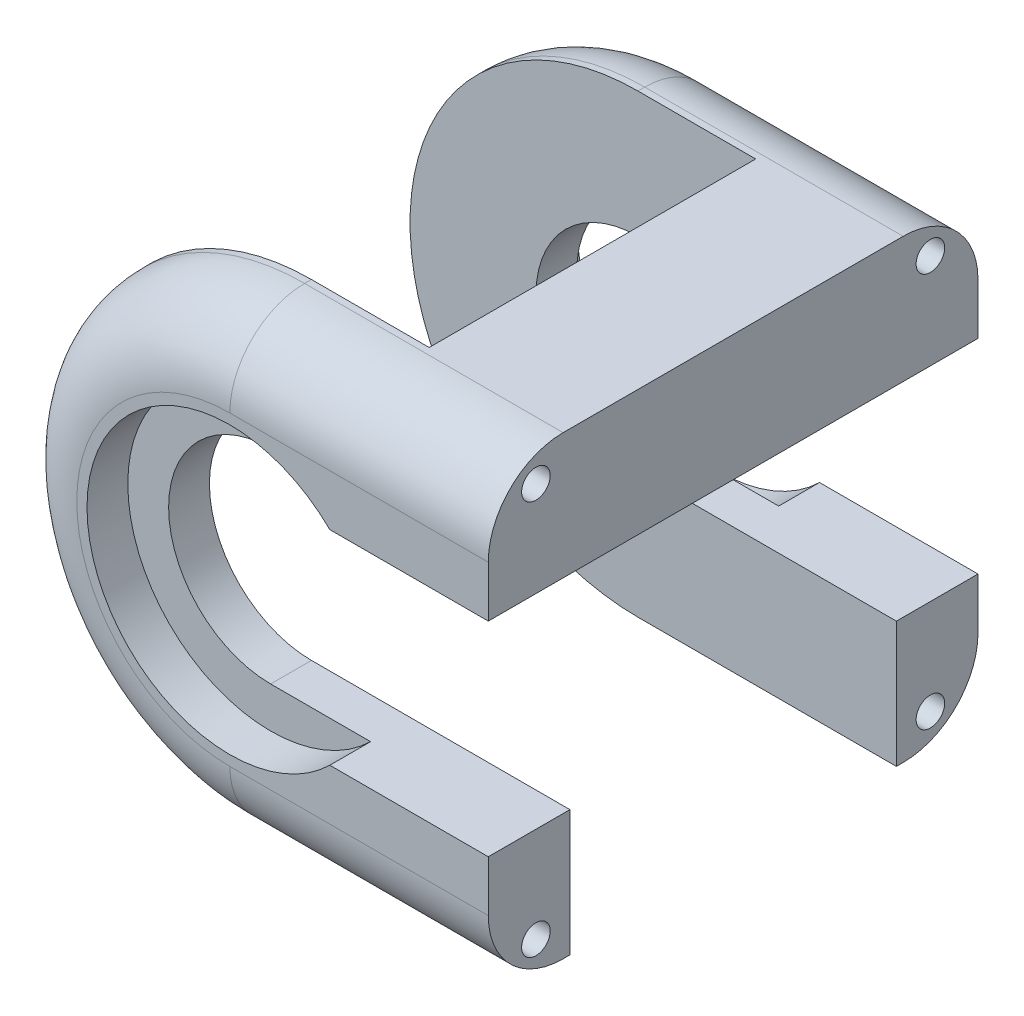
ISO-10303-21;
HEADER;
FILE_DESCRIPTION(('STEP AP214'),'2;1');
FILE_NAME('part.step','',(''),(''),'','','');
FILE_SCHEMA(('AUTOMOTIVE_DESIGN { 1 0 10303 214 1 1 1 1 }'));
ENDSEC;
DATA;
#1=APPLICATION_CONTEXT('core data for automotive mechanical design processes');
#2=APPLICATION_PROTOCOL_DEFINITION('international standard','automotive_design',2000,#1);
#3=PRODUCT_CONTEXT('',#1,'mechanical');
#4=PRODUCT('Part','Part','',(#3));
#5=PRODUCT_RELATED_PRODUCT_CATEGORY('part','',(#4));
#6=PRODUCT_DEFINITION_FORMATION('','',#4);
#7=PRODUCT_DEFINITION_CONTEXT('part definition',#1,'design');
#8=PRODUCT_DEFINITION('design','',#6,#7);
#9=PRODUCT_DEFINITION_SHAPE('','',#8);
#10=(LENGTH_UNIT() NAMED_UNIT(*) SI_UNIT(.MILLI.,.METRE.));
#11=(NAMED_UNIT(*) PLANE_ANGLE_UNIT() SI_UNIT($,.RADIAN.));
#12=(NAMED_UNIT(*) SI_UNIT($,.STERADIAN.) SOLID_ANGLE_UNIT());
#13=UNCERTAINTY_MEASURE_WITH_UNIT(LENGTH_MEASURE(1.E-05),#10,'distance_accuracy_value','');
#14=(GEOMETRIC_REPRESENTATION_CONTEXT(3) GLOBAL_UNCERTAINTY_ASSIGNED_CONTEXT((#13)) GLOBAL_UNIT_ASSIGNED_CONTEXT((#10,
#11,#12)) REPRESENTATION_CONTEXT('',''));
#15=CARTESIAN_POINT('',(0.,0.,0.));
#16=DIRECTION('',(0.,0.,1.));
#17=DIRECTION('',(1.,0.,0.));
#18=AXIS2_PLACEMENT_3D('',#15,#16,#17);
#19=CARTESIAN_POINT('',(0.,0.,72.));
#20=DIRECTION('',(1.,0.,0.));
#21=DIRECTION('',(0.,1.,0.));
#22=AXIS2_PLACEMENT_3D('',#19,#20,#21);
#23=PLANE('',#22);
#24=DIRECTION('',(0.,-1.,0.));
#25=VECTOR('',#24,1.);
#26=CARTESIAN_POINT('',(0.,18.5,12.));
#27=LINE('',#26,#25);
#28=CARTESIAN_POINT('',(0.,18.5,12.));
#29=VERTEX_POINT('',#28);
#30=CARTESIAN_POINT('',(0.,0.,12.));
#31=VERTEX_POINT('',#30);
#32=EDGE_CURVE('E246',#29,#31,#27,.T.);
#33=ORIENTED_EDGE('',*,*,#32,.T.);
#34=DIRECTION('',(0.,0.,-1.));
#35=VECTOR('',#34,1.);
#36=CARTESIAN_POINT('',(0.,0.,72.));
#37=LINE('',#36,#35);
#38=CARTESIAN_POINT('',(0.,0.,11.));
#39=VERTEX_POINT('',#38);
#40=EDGE_CURVE('E254',#31,#39,#37,.T.);
#41=ORIENTED_EDGE('',*,*,#40,.T.);
#42=CARTESIAN_POINT('',(0.,11.,11.));
#43=DIRECTION('',(1.,0.,0.));
#44=DIRECTION('',(0.,1.,0.));
#45=AXIS2_PLACEMENT_3D('',#42,#43,#44);
#46=CIRCLE('',#45,11.);
#47=CARTESIAN_POINT('',(0.,11.,0.));
#48=VERTEX_POINT('',#47);
#49=EDGE_CURVE('E307',#39,#48,#46,.T.);
#50=ORIENTED_EDGE('',*,*,#49,.T.);
#51=DIRECTION('',(0.,-1.,0.));
#52=VECTOR('',#51,1.);
#53=CARTESIAN_POINT('',(0.,0.,0.));
#54=LINE('',#53,#52);
#55=CARTESIAN_POINT('',(0.,18.5,0.));
#56=VERTEX_POINT('',#55);
#57=EDGE_CURVE('E405',#56,#48,#54,.T.);
#58=ORIENTED_EDGE('',*,*,#57,.F.);
#59=DIRECTION('',(0.,0.,1.));
#60=VECTOR('',#59,1.);
#61=CARTESIAN_POINT('',(0.,18.5,-0.001000000000001));
#62=LINE('',#61,#60);
#63=EDGE_CURVE('E481',#56,#29,#62,.T.);
#64=ORIENTED_EDGE('',*,*,#63,.T.);
#65=EDGE_LOOP('',(#33,#41,#50,#58,#64));
#66=FACE_BOUND('',#65,.T.);
#67=CARTESIAN_POINT('',(0.,4.50000000000001,6.99999999999999));
#68=DIRECTION('',(1.,0.,0.));
#69=DIRECTION('',(0.,0.,-1.));
#70=AXIS2_PLACEMENT_3D('',#67,#68,#69);
#71=CIRCLE('',#70,2.09999999999999);
#72=CARTESIAN_POINT('',(0.,4.50000000000001,4.9));
#73=VERTEX_POINT('',#72);
#74=EDGE_CURVE('E720',#73,#73,#71,.T.);
#75=ORIENTED_EDGE('',*,*,#74,.F.);
#76=EDGE_LOOP('',(#75));
#77=FACE_BOUND('',#76,.T.);
#78=ADVANCED_FACE('F46',(#66,#77),#23,.T.);
#79=DIRECTION('',(0.,1.,0.));
#80=VECTOR('',#79,1.);
#81=CARTESIAN_POINT('',(0.,18.5,60.));
#82=LINE('',#81,#80);
#83=CARTESIAN_POINT('',(0.,0.,60.));
#84=VERTEX_POINT('',#83);
#85=CARTESIAN_POINT('',(0.,18.5,60.));
#86=VERTEX_POINT('',#85);
#87=EDGE_CURVE('E238',#84,#86,#82,.T.);
#88=ORIENTED_EDGE('',*,*,#87,.T.);
#89=CARTESIAN_POINT('',(0.,18.5,72.));
#90=VERTEX_POINT('',#89);
#91=EDGE_CURVE('E488',#86,#90,#62,.T.);
#92=ORIENTED_EDGE('',*,*,#91,.T.);
#93=DIRECTION('',(0.,-1.,0.));
#94=VECTOR('',#93,1.);
#95=CARTESIAN_POINT('',(0.,0.,72.));
#96=LINE('',#95,#94);
#97=CARTESIAN_POINT('',(0.,11.,72.));
#98=VERTEX_POINT('',#97);
#99=EDGE_CURVE('E410',#90,#98,#96,.T.);
#100=ORIENTED_EDGE('',*,*,#99,.T.);
#101=CARTESIAN_POINT('',(0.,11.,61.));
#102=DIRECTION('',(1.,0.,0.));
#103=DIRECTION('',(0.,1.,0.));
#104=AXIS2_PLACEMENT_3D('',#101,#102,#103);
#105=CIRCLE('',#104,11.);
#106=CARTESIAN_POINT('',(0.,0.,61.));
#107=VERTEX_POINT('',#106);
#108=EDGE_CURVE('E251',#98,#107,#105,.T.);
#109=ORIENTED_EDGE('',*,*,#108,.T.);
#110=EDGE_CURVE('E226',#107,#84,#37,.T.);
#111=ORIENTED_EDGE('',*,*,#110,.T.);
#112=EDGE_LOOP('',(#88,#92,#100,#109,#111));
#113=FACE_BOUND('',#112,.T.);
#114=CARTESIAN_POINT('',(0.,4.5,65.));
#115=DIRECTION('',(1.,0.,0.));
#116=DIRECTION('',(0.,0.,-1.));
#117=AXIS2_PLACEMENT_3D('',#114,#115,#116);
#118=CIRCLE('',#117,2.09999999999999);
#119=CARTESIAN_POINT('',(0.,4.5,62.9));
#120=VERTEX_POINT('',#119);
#121=EDGE_CURVE('E728',#120,#120,#118,.T.);
#122=ORIENTED_EDGE('',*,*,#121,.F.);
#123=EDGE_LOOP('',(#122));
#124=FACE_BOUND('',#123,.T.);
#125=ADVANCED_FACE('F248',(#113,#124),#23,.T.);
#126=CARTESIAN_POINT('',(-38.,33.5,200.));
#127=DIRECTION('',(0.,0.,-1.));
#128=DIRECTION('',(-1.,0.,0.));
#129=AXIS2_PLACEMENT_3D('',#126,#127,#128);
#130=CYLINDRICAL_SURFACE('',#129,15.);
#131=DIRECTION('',(0.,0.,-1.));
#132=VECTOR('',#131,1.);
#133=CARTESIAN_POINT('',(-38.,18.5,200.));
#134=LINE('',#133,#132);
#135=CARTESIAN_POINT('',(-38.,18.5,6.00000000000001));
#136=VERTEX_POINT('',#135);
#137=CARTESIAN_POINT('',(-38.,18.5,12.));
#138=VERTEX_POINT('',#137);
#139=EDGE_CURVE('E535',#136,#138,#134,.F.);
#140=ORIENTED_EDGE('',*,*,#139,.F.);
#141=CARTESIAN_POINT('',(-38.,33.5,6.00000000000001));
#142=DIRECTION('',(0.,0.,-1.));
#143=DIRECTION('',(-1.,0.,0.));
#144=AXIS2_PLACEMENT_3D('',#141,#142,#143);
#145=CIRCLE('',#144,15.);
#146=CARTESIAN_POINT('',(-38.,48.5,6.00000000000001));
#147=VERTEX_POINT('',#146);
#148=EDGE_CURVE('E235',#136,#147,#145,.T.);
#149=ORIENTED_EDGE('',*,*,#148,.T.);
#150=DIRECTION('',(0.,0.,1.));
#151=VECTOR('',#150,1.);
#152=CARTESIAN_POINT('',(-38.,48.5,-0.001000000000001));
#153=LINE('',#152,#151);
#154=CARTESIAN_POINT('',(-38.,48.5,12.));
#155=VERTEX_POINT('',#154);
#156=EDGE_CURVE('E486',#147,#155,#153,.T.);
#157=ORIENTED_EDGE('',*,*,#156,.T.);
#158=CARTESIAN_POINT('',(-38.,33.5,12.));
#159=DIRECTION('',(0.,0.,-1.));
#160=DIRECTION('',(-1.,0.,0.));
#161=AXIS2_PLACEMENT_3D('',#158,#159,#160);
#162=CIRCLE('',#161,15.);
#163=EDGE_CURVE('E279',#138,#155,#162,.T.);
#164=ORIENTED_EDGE('',*,*,#163,.F.);
#165=EDGE_LOOP('',(#140,#149,#157,#164));
#166=FACE_BOUND('',#165,.T.);
#167=ADVANCED_FACE('F455',(#166),#130,.F.);
#168=DIRECTION('',(0.,0.,-1.));
#169=VECTOR('',#168,1.);
#170=CARTESIAN_POINT('',(-38.,18.5,200.));
#171=LINE('',#170,#169);
#172=CARTESIAN_POINT('',(-38.,18.5,60.));
#173=VERTEX_POINT('',#172);
#174=CARTESIAN_POINT('',(-38.,18.5,66.));
#175=VERTEX_POINT('',#174);
#176=EDGE_CURVE('E532',#173,#175,#171,.F.);
#177=ORIENTED_EDGE('',*,*,#176,.F.);
#178=CARTESIAN_POINT('',(-38.,33.5,60.));
#179=DIRECTION('',(0.,0.,1.));
#180=DIRECTION('',(1.,0.,0.));
#181=AXIS2_PLACEMENT_3D('',#178,#179,#180);
#182=CIRCLE('',#181,15.);
#183=CARTESIAN_POINT('',(-38.,48.5,60.));
#184=VERTEX_POINT('',#183);
#185=EDGE_CURVE('E283',#184,#173,#182,.T.);
#186=ORIENTED_EDGE('',*,*,#185,.F.);
#187=CARTESIAN_POINT('',(-38.,48.5,66.));
#188=VERTEX_POINT('',#187);
#189=EDGE_CURVE('E480',#184,#188,#153,.T.);
#190=ORIENTED_EDGE('',*,*,#189,.T.);
#191=CARTESIAN_POINT('',(-38.,33.5,66.));
#192=DIRECTION('',(0.,0.,1.));
#193=DIRECTION('',(1.,0.,0.));
#194=AXIS2_PLACEMENT_3D('',#191,#192,#193);
#195=CIRCLE('',#194,15.);
#196=EDGE_CURVE('E360',#188,#175,#195,.T.);
#197=ORIENTED_EDGE('',*,*,#196,.T.);
#198=EDGE_LOOP('',(#177,#186,#190,#197));
#199=FACE_BOUND('',#198,.T.);
#200=ADVANCED_FACE('F563',(#199),#130,.F.);
#201=CARTESIAN_POINT('',(0.,0.,72.));
#202=DIRECTION('',(0.,-1.,0.));
#203=DIRECTION('',(1.,0.,0.));
#204=AXIS2_PLACEMENT_3D('',#201,#202,#203);
#205=PLANE('',#204);
#206=DIRECTION('',(-1.,0.,0.));
#207=VECTOR('',#206,1.);
#208=CARTESIAN_POINT('',(-71.5,0.,60.));
#209=LINE('',#208,#207);
#210=CARTESIAN_POINT('',(-38.,0.,60.));
#211=VERTEX_POINT('',#210);
#212=EDGE_CURVE('E221',#84,#211,#209,.T.);
#213=ORIENTED_EDGE('',*,*,#212,.F.);
#214=ORIENTED_EDGE('',*,*,#110,.F.);
#215=DIRECTION('',(-1.,0.,0.));
#216=VECTOR('',#215,1.);
#217=CARTESIAN_POINT('',(0.,0.,61.));
#218=LINE('',#217,#216);
#219=CARTESIAN_POINT('',(-38.,0.,61.));
#220=VERTEX_POINT('',#219);
#221=EDGE_CURVE('E288',#107,#220,#218,.T.);
#222=ORIENTED_EDGE('',*,*,#221,.T.);
#223=DIRECTION('',(0.,0.,-1.));
#224=VECTOR('',#223,1.);
#225=CARTESIAN_POINT('',(-38.,0.,72.));
#226=LINE('',#225,#224);
#227=EDGE_CURVE('E229',#220,#211,#226,.T.);
#228=ORIENTED_EDGE('',*,*,#227,.T.);
#229=EDGE_LOOP('',(#213,#214,#222,#228));
#230=FACE_BOUND('',#229,.T.);
#231=ADVANCED_FACE('F223',(#230),#205,.T.);
#232=CARTESIAN_POINT('',(-38.,33.5,72.));
#233=DIRECTION('',(0.,0.,-1.));
#234=DIRECTION('',(-1.,0.,0.));
#235=AXIS2_PLACEMENT_3D('',#232,#233,#234);
#236=CYLINDRICAL_SURFACE('',#235,33.5);
#237=ORIENTED_EDGE('',*,*,#227,.F.);
#238=CARTESIAN_POINT('',(-38.,33.5,61.));
#239=DIRECTION('',(0.,0.,1.));
#240=DIRECTION('',(1.,0.,0.));
#241=AXIS2_PLACEMENT_3D('',#238,#239,#240);
#242=CIRCLE('',#241,33.5);
#243=CARTESIAN_POINT('',(-38.,67.,61.));
#244=VERTEX_POINT('',#243);
#245=EDGE_CURVE('E313',#220,#244,#242,.F.);
#246=ORIENTED_EDGE('',*,*,#245,.T.);
#247=DIRECTION('',(0.,0.,-1.));
#248=VECTOR('',#247,1.);
#249=CARTESIAN_POINT('',(-38.,67.,72.));
#250=LINE('',#249,#248);
#251=CARTESIAN_POINT('',(-38.,67.,60.));
#252=VERTEX_POINT('',#251);
#253=EDGE_CURVE('E268',#244,#252,#250,.T.);
#254=ORIENTED_EDGE('',*,*,#253,.T.);
#255=CARTESIAN_POINT('',(-38.,33.5,60.));
#256=DIRECTION('',(0.,0.,1.));
#257=DIRECTION('',(1.,0.,0.));
#258=AXIS2_PLACEMENT_3D('',#255,#256,#257);
#259=CIRCLE('',#258,33.5);
#260=EDGE_CURVE('E389',#252,#211,#259,.T.);
#261=ORIENTED_EDGE('',*,*,#260,.T.);
#262=EDGE_LOOP('',(#237,#246,#254,#261));
#263=FACE_BOUND('',#262,.T.);
#264=ADVANCED_FACE('F460',(#263),#236,.T.);
#265=CARTESIAN_POINT('',(0.,62.5,65.));
#266=DIRECTION('',(1.,0.,0.));
#267=DIRECTION('',(0.,0.,-1.));
#268=AXIS2_PLACEMENT_3D('',#265,#266,#267);
#269=CIRCLE('',#268,2.09999999999999);
#270=CARTESIAN_POINT('',(0.,62.5,62.9));
#271=VERTEX_POINT('',#270);
#272=EDGE_CURVE('E245',#271,#271,#269,.T.);
#273=ORIENTED_EDGE('',*,*,#272,.F.);
#274=EDGE_LOOP('',(#273));
#275=FACE_BOUND('',#274,.T.);
#276=CARTESIAN_POINT('',(0.,62.5,6.99999999999999));
#277=DIRECTION('',(1.,0.,0.));
#278=DIRECTION('',(0.,0.,-1.));
#279=AXIS2_PLACEMENT_3D('',#276,#277,#278);
#280=CIRCLE('',#279,2.09999999999999);
#281=CARTESIAN_POINT('',(0.,62.5,4.9));
#282=VERTEX_POINT('',#281);
#283=EDGE_CURVE('E475',#282,#282,#280,.T.);
#284=ORIENTED_EDGE('',*,*,#283,.F.);
#285=EDGE_LOOP('',(#284));
#286=FACE_BOUND('',#285,.T.);
#287=DIRECTION('',(0.,0.,1.));
#288=VECTOR('',#287,1.);
#289=CARTESIAN_POINT('',(0.,48.5,-0.001000000000001));
#290=LINE('',#289,#288);
#291=CARTESIAN_POINT('',(0.,48.5,0.));
#292=VERTEX_POINT('',#291);
#293=CARTESIAN_POINT('',(0.,48.5,72.));
#294=VERTEX_POINT('',#293);
#295=EDGE_CURVE('E476',#292,#294,#290,.T.);
#296=ORIENTED_EDGE('',*,*,#295,.F.);
#297=CARTESIAN_POINT('',(0.,56.,0.));
#298=VERTEX_POINT('',#297);
#299=EDGE_CURVE('E263',#298,#292,#54,.T.);
#300=ORIENTED_EDGE('',*,*,#299,.F.);
#301=CARTESIAN_POINT('',(0.,56.,11.));
#302=DIRECTION('',(1.,0.,0.));
#303=DIRECTION('',(0.,1.,0.));
#304=AXIS2_PLACEMENT_3D('',#301,#302,#303);
#305=CIRCLE('',#304,11.);
#306=CARTESIAN_POINT('',(0.,67.,11.));
#307=VERTEX_POINT('',#306);
#308=EDGE_CURVE('E301',#298,#307,#305,.T.);
#309=ORIENTED_EDGE('',*,*,#308,.T.);
#310=DIRECTION('',(0.,0.,-1.));
#311=VECTOR('',#310,1.);
#312=CARTESIAN_POINT('',(0.,67.,72.));
#313=LINE('',#312,#311);
#314=CARTESIAN_POINT('',(0.,67.,61.));
#315=VERTEX_POINT('',#314);
#316=EDGE_CURVE('E271',#315,#307,#313,.T.);
#317=ORIENTED_EDGE('',*,*,#316,.F.);
#318=CARTESIAN_POINT('',(0.,56.,61.));
#319=DIRECTION('',(1.,0.,0.));
#320=DIRECTION('',(0.,1.,0.));
#321=AXIS2_PLACEMENT_3D('',#318,#319,#320);
#322=CIRCLE('',#321,11.);
#323=CARTESIAN_POINT('',(0.,56.,72.));
#324=VERTEX_POINT('',#323);
#325=EDGE_CURVE('E304',#315,#324,#322,.T.);
#326=ORIENTED_EDGE('',*,*,#325,.T.);
#327=EDGE_CURVE('E261',#324,#294,#96,.T.);
#328=ORIENTED_EDGE('',*,*,#327,.T.);
#329=EDGE_LOOP('',(#296,#300,#309,#317,#326,#328));
#330=FACE_BOUND('',#329,.T.);
#331=ADVANCED_FACE('F451',(#275,#286,#330),#23,.T.);
#332=CARTESIAN_POINT('',(0.,67.,72.));
#333=DIRECTION('',(0.,1.,0.));
#334=DIRECTION('',(0.,0.,1.));
#335=AXIS2_PLACEMENT_3D('',#332,#333,#334);
#336=PLANE('',#335);
#337=ORIENTED_EDGE('',*,*,#253,.F.);
#338=DIRECTION('',(1.,0.,0.));
#339=VECTOR('',#338,1.);
#340=CARTESIAN_POINT('',(0.,67.,61.));
#341=LINE('',#340,#339);
#342=EDGE_CURVE('E11',#244,#315,#341,.T.);
#343=ORIENTED_EDGE('',*,*,#342,.T.);
#344=ORIENTED_EDGE('',*,*,#316,.T.);
#345=DIRECTION('',(1.,0.,0.));
#346=VECTOR('',#345,1.);
#347=CARTESIAN_POINT('',(-38.,67.,11.));
#348=LINE('',#347,#346);
#349=CARTESIAN_POINT('',(-38.,67.,11.));
#350=VERTEX_POINT('',#349);
#351=EDGE_CURVE('E56',#307,#350,#348,.F.);
#352=ORIENTED_EDGE('',*,*,#351,.T.);
#353=CARTESIAN_POINT('',(-38.,67.,12.));
#354=VERTEX_POINT('',#353);
#355=EDGE_CURVE('E267',#354,#350,#250,.T.);
#356=ORIENTED_EDGE('',*,*,#355,.F.);
#357=DIRECTION('',(1.,0.,0.));
#358=VECTOR('',#357,1.);
#359=CARTESIAN_POINT('',(-71.5,67.,12.));
#360=LINE('',#359,#358);
#361=CARTESIAN_POINT('',(-20.6887285151124,67.,12.));
#362=VERTEX_POINT('',#361);
#363=EDGE_CURVE('E234',#354,#362,#360,.T.);
#364=ORIENTED_EDGE('',*,*,#363,.T.);
#365=DIRECTION('',(0.,0.,1.));
#366=VECTOR('',#365,1.);
#367=CARTESIAN_POINT('',(-20.6887285151124,67.,60.));
#368=LINE('',#367,#366);
#369=CARTESIAN_POINT('',(-20.6887285151124,67.,60.));
#370=VERTEX_POINT('',#369);
#371=EDGE_CURVE('E370',#362,#370,#368,.T.);
#372=ORIENTED_EDGE('',*,*,#371,.T.);
#373=DIRECTION('',(-1.,0.,0.));
#374=VECTOR('',#373,1.);
#375=CARTESIAN_POINT('',(-71.5,67.,60.));
#376=LINE('',#375,#374);
#377=EDGE_CURVE('E374',#370,#252,#376,.T.);
#378=ORIENTED_EDGE('',*,*,#377,.T.);
#379=EDGE_LOOP('',(#337,#343,#344,#352,#356,#364,#372,#378));
#380=FACE_BOUND('',#379,.T.);
#381=ADVANCED_FACE('F459',(#380),#336,.T.);
#382=ORIENTED_EDGE('',*,*,#355,.T.);
#383=CARTESIAN_POINT('',(-38.,33.5,11.));
#384=DIRECTION('',(0.,0.,1.));
#385=DIRECTION('',(1.,0.,0.));
#386=AXIS2_PLACEMENT_3D('',#383,#384,#385);
#387=CIRCLE('',#386,33.5);
#388=CARTESIAN_POINT('',(-38.,0.,11.));
#389=VERTEX_POINT('',#388);
#390=EDGE_CURVE('E326',#350,#389,#387,.T.);
#391=ORIENTED_EDGE('',*,*,#390,.T.);
#392=CARTESIAN_POINT('',(-38.,0.,12.));
#393=VERTEX_POINT('',#392);
#394=EDGE_CURVE('E253',#393,#389,#226,.T.);
#395=ORIENTED_EDGE('',*,*,#394,.F.);
#396=CARTESIAN_POINT('',(-38.,33.5,12.));
#397=DIRECTION('',(0.,0.,-1.));
#398=DIRECTION('',(-1.,0.,0.));
#399=AXIS2_PLACEMENT_3D('',#396,#397,#398);
#400=CIRCLE('',#399,33.5);
#401=EDGE_CURVE('E383',#393,#354,#400,.T.);
#402=ORIENTED_EDGE('',*,*,#401,.T.);
#403=EDGE_LOOP('',(#382,#391,#395,#402));
#404=FACE_BOUND('',#403,.T.);
#405=ADVANCED_FACE('F466',(#404),#236,.T.);
#406=ORIENTED_EDGE('',*,*,#40,.F.);
#407=DIRECTION('',(1.,0.,0.));
#408=VECTOR('',#407,1.);
#409=CARTESIAN_POINT('',(0.,0.,12.));
#410=LINE('',#409,#408);
#411=EDGE_CURVE('E275',#393,#31,#410,.T.);
#412=ORIENTED_EDGE('',*,*,#411,.F.);
#413=ORIENTED_EDGE('',*,*,#394,.T.);
#414=DIRECTION('',(-1.,0.,0.));
#415=VECTOR('',#414,1.);
#416=CARTESIAN_POINT('',(0.,0.,11.));
#417=LINE('',#416,#415);
#418=EDGE_CURVE('E278',#389,#39,#417,.F.);
#419=ORIENTED_EDGE('',*,*,#418,.T.);
#420=EDGE_LOOP('',(#406,#412,#413,#419));
#421=FACE_BOUND('',#420,.T.);
#422=ADVANCED_FACE('F596',(#421),#205,.T.);
#423=CARTESIAN_POINT('',(0.,0.,72.));
#424=DIRECTION('',(0.,0.,1.));
#425=DIRECTION('',(1.,0.,0.));
#426=AXIS2_PLACEMENT_3D('',#423,#424,#425);
#427=PLANE('',#426);
#428=DIRECTION('',(1.,0.,0.));
#429=VECTOR('',#428,1.);
#430=CARTESIAN_POINT('',(0.,18.5,72.));
#431=LINE('',#430,#429);
#432=CARTESIAN_POINT('',(-23.3030615433009,18.5,72.));
#433=VERTEX_POINT('',#432);
#434=EDGE_CURVE('E552',#433,#90,#431,.T.);
#435=ORIENTED_EDGE('',*,*,#434,.F.);
#436=CARTESIAN_POINT('',(-38.,33.5,72.));
#437=DIRECTION('',(0.,0.,1.));
#438=DIRECTION('',(1.,0.,0.));
#439=AXIS2_PLACEMENT_3D('',#436,#437,#438);
#440=CIRCLE('',#439,21.);
#441=CARTESIAN_POINT('',(-23.3030615433009,48.5,72.));
#442=VERTEX_POINT('',#441);
#443=EDGE_CURVE('E392',#442,#433,#440,.T.);
#444=ORIENTED_EDGE('',*,*,#443,.F.);
#445=DIRECTION('',(-1.,0.,0.));
#446=VECTOR('',#445,1.);
#447=CARTESIAN_POINT('',(0.,48.5,72.));
#448=LINE('',#447,#446);
#449=EDGE_CURVE('E493',#294,#442,#448,.T.);
#450=ORIENTED_EDGE('',*,*,#449,.F.);
#451=ORIENTED_EDGE('',*,*,#327,.F.);
#452=DIRECTION('',(1.,0.,0.));
#453=VECTOR('',#452,1.);
#454=CARTESIAN_POINT('',(0.,56.,72.));
#455=LINE('',#454,#453);
#456=CARTESIAN_POINT('',(-38.,56.,72.));
#457=VERTEX_POINT('',#456);
#458=EDGE_CURVE('E291',#324,#457,#455,.F.);
#459=ORIENTED_EDGE('',*,*,#458,.T.);
#460=CARTESIAN_POINT('',(-38.,33.5,72.));
#461=DIRECTION('',(0.,0.,1.));
#462=DIRECTION('',(1.,0.,0.));
#463=AXIS2_PLACEMENT_3D('',#460,#461,#462);
#464=CIRCLE('',#463,22.5);
#465=CARTESIAN_POINT('',(-38.,11.,72.));
#466=VERTEX_POINT('',#465);
#467=EDGE_CURVE('E294',#457,#466,#464,.T.);
#468=ORIENTED_EDGE('',*,*,#467,.T.);
#469=DIRECTION('',(-1.,0.,0.));
#470=VECTOR('',#469,1.);
#471=CARTESIAN_POINT('',(0.,11.,72.));
#472=LINE('',#471,#470);
#473=EDGE_CURVE('E297',#466,#98,#472,.F.);
#474=ORIENTED_EDGE('',*,*,#473,.T.);
#475=ORIENTED_EDGE('',*,*,#99,.F.);
#476=EDGE_LOOP('',(#435,#444,#450,#451,#459,#468,#474,#475));
#477=FACE_BOUND('',#476,.T.);
#478=ADVANCED_FACE('F558',(#477),#427,.T.);
#479=CARTESIAN_POINT('',(0.,0.,0.));
#480=DIRECTION('',(0.,0.,1.));
#481=DIRECTION('',(1.,0.,0.));
#482=AXIS2_PLACEMENT_3D('',#479,#480,#481);
#483=PLANE('',#482);
#484=CARTESIAN_POINT('',(-38.,33.5,0.));
#485=DIRECTION('',(0.,0.,-1.));
#486=DIRECTION('',(-1.,0.,0.));
#487=AXIS2_PLACEMENT_3D('',#484,#485,#486);
#488=CIRCLE('',#487,21.);
#489=CARTESIAN_POINT('',(-23.3030615433009,18.5,0.));
#490=VERTEX_POINT('',#489);
#491=CARTESIAN_POINT('',(-23.3030615433009,48.5,0.));
#492=VERTEX_POINT('',#491);
#493=EDGE_CURVE('E397',#490,#492,#488,.T.);
#494=ORIENTED_EDGE('',*,*,#493,.F.);
#495=DIRECTION('',(-1.,0.,0.));
#496=VECTOR('',#495,1.);
#497=CARTESIAN_POINT('',(0.,18.5,0.));
#498=LINE('',#497,#496);
#499=EDGE_CURVE('E429',#56,#490,#498,.T.);
#500=ORIENTED_EDGE('',*,*,#499,.F.);
#501=ORIENTED_EDGE('',*,*,#57,.T.);
#502=DIRECTION('',(-1.,0.,0.));
#503=VECTOR('',#502,1.);
#504=CARTESIAN_POINT('',(-38.,11.,0.));
#505=LINE('',#504,#503);
#506=CARTESIAN_POINT('',(-38.,11.,0.));
#507=VERTEX_POINT('',#506);
#508=EDGE_CURVE('E322',#48,#507,#505,.T.);
#509=ORIENTED_EDGE('',*,*,#508,.T.);
#510=CARTESIAN_POINT('',(-38.,33.5,0.));
#511=DIRECTION('',(0.,0.,1.));
#512=DIRECTION('',(1.,0.,0.));
#513=AXIS2_PLACEMENT_3D('',#510,#511,#512);
#514=CIRCLE('',#513,22.5);
#515=CARTESIAN_POINT('',(-38.,56.,0.));
#516=VERTEX_POINT('',#515);
#517=EDGE_CURVE('E319',#507,#516,#514,.F.);
#518=ORIENTED_EDGE('',*,*,#517,.T.);
#519=DIRECTION('',(1.,0.,0.));
#520=VECTOR('',#519,1.);
#521=CARTESIAN_POINT('',(0.,56.,0.));
#522=LINE('',#521,#520);
#523=EDGE_CURVE('E316',#516,#298,#522,.T.);
#524=ORIENTED_EDGE('',*,*,#523,.T.);
#525=ORIENTED_EDGE('',*,*,#299,.T.);
#526=DIRECTION('',(1.,0.,0.));
#527=VECTOR('',#526,1.);
#528=CARTESIAN_POINT('',(0.,48.5,0.));
#529=LINE('',#528,#527);
#530=EDGE_CURVE('E520',#492,#292,#529,.T.);
#531=ORIENTED_EDGE('',*,*,#530,.F.);
#532=EDGE_LOOP('',(#494,#500,#501,#509,#518,#524,#525,#531));
#533=FACE_BOUND('',#532,.T.);
#534=ADVANCED_FACE('F428',(#533),#483,.F.);
#535=CARTESIAN_POINT('',(-38.,33.5,6.));
#536=DIRECTION('',(0.,0.,-1.));
#537=DIRECTION('',(-1.,0.,0.));
#538=AXIS2_PLACEMENT_3D('',#535,#536,#537);
#539=CYLINDRICAL_SURFACE('',#538,21.);
#540=CARTESIAN_POINT('',(-38.,33.5,6.));
#541=DIRECTION('',(0.,0.,-1.));
#542=DIRECTION('',(-1.,0.,0.));
#543=AXIS2_PLACEMENT_3D('',#540,#541,#542);
#544=CIRCLE('',#543,21.);
#545=CARTESIAN_POINT('',(-23.3030615433009,18.5,6.));
#546=VERTEX_POINT('',#545);
#547=CARTESIAN_POINT('',(-23.3030615433009,48.5,6.));
#548=VERTEX_POINT('',#547);
#549=EDGE_CURVE('E401',#546,#548,#544,.T.);
#550=ORIENTED_EDGE('',*,*,#549,.F.);
#551=DIRECTION('',(0.,0.,-1.));
#552=VECTOR('',#551,1.);
#553=CARTESIAN_POINT('',(-23.3030615433009,18.5,6.));
#554=LINE('',#553,#552);
#555=EDGE_CURVE('E549',#490,#546,#554,.F.);
#556=ORIENTED_EDGE('',*,*,#555,.F.);
#557=ORIENTED_EDGE('',*,*,#493,.T.);
#558=DIRECTION('',(0.,0.,-1.));
#559=VECTOR('',#558,1.);
#560=CARTESIAN_POINT('',(-23.3030615433009,48.5,6.));
#561=LINE('',#560,#559);
#562=EDGE_CURVE('E338',#548,#492,#561,.T.);
#563=ORIENTED_EDGE('',*,*,#562,.F.);
#564=EDGE_LOOP('',(#550,#556,#557,#563));
#565=FACE_BOUND('',#564,.T.);
#566=ADVANCED_FACE('F590',(#565),#539,.F.);
#567=CARTESIAN_POINT('',(-38.,33.5,6.));
#568=DIRECTION('',(0.,0.,-1.));
#569=DIRECTION('',(-1.,0.,0.));
#570=AXIS2_PLACEMENT_3D('',#567,#568,#569);
#571=PLANE('',#570);
#572=DIRECTION('',(1.,0.,0.));
#573=VECTOR('',#572,1.);
#574=CARTESIAN_POINT('',(0.,18.5,6.));
#575=LINE('',#574,#573);
#576=EDGE_CURVE('E545',#136,#546,#575,.T.);
#577=ORIENTED_EDGE('',*,*,#576,.T.);
#578=ORIENTED_EDGE('',*,*,#549,.T.);
#579=DIRECTION('',(-1.,0.,0.));
#580=VECTOR('',#579,1.);
#581=CARTESIAN_POINT('',(0.,48.5,6.));
#582=LINE('',#581,#580);
#583=EDGE_CURVE('E348',#548,#147,#582,.T.);
#584=ORIENTED_EDGE('',*,*,#583,.T.);
#585=ORIENTED_EDGE('',*,*,#148,.F.);
#586=EDGE_LOOP('',(#577,#578,#584,#585));
#587=FACE_BOUND('',#586,.T.);
#588=ADVANCED_FACE('F587',(#587),#571,.T.);
#589=CARTESIAN_POINT('',(-38.,33.5,66.));
#590=DIRECTION('',(0.,0.,1.));
#591=DIRECTION('',(1.,0.,0.));
#592=AXIS2_PLACEMENT_3D('',#589,#590,#591);
#593=CYLINDRICAL_SURFACE('',#592,21.);
#594=ORIENTED_EDGE('',*,*,#443,.T.);
#595=DIRECTION('',(0.,0.,1.));
#596=VECTOR('',#595,1.);
#597=CARTESIAN_POINT('',(-23.3030615433009,18.5,66.));
#598=LINE('',#597,#596);
#599=CARTESIAN_POINT('',(-23.3030615433009,18.5,66.));
#600=VERTEX_POINT('',#599);
#601=EDGE_CURVE('E515',#600,#433,#598,.T.);
#602=ORIENTED_EDGE('',*,*,#601,.F.);
#603=CARTESIAN_POINT('',(-38.,33.5,66.));
#604=DIRECTION('',(0.,0.,1.));
#605=DIRECTION('',(1.,0.,0.));
#606=AXIS2_PLACEMENT_3D('',#603,#604,#605);
#607=CIRCLE('',#606,21.);
#608=CARTESIAN_POINT('',(-23.3030615433009,48.5,66.));
#609=VERTEX_POINT('',#608);
#610=EDGE_CURVE('E393',#609,#600,#607,.T.);
#611=ORIENTED_EDGE('',*,*,#610,.F.);
#612=DIRECTION('',(0.,0.,1.));
#613=VECTOR('',#612,1.);
#614=CARTESIAN_POINT('',(-23.3030615433009,48.5,66.));
#615=LINE('',#614,#613);
#616=EDGE_CURVE('E513',#442,#609,#615,.F.);
#617=ORIENTED_EDGE('',*,*,#616,.F.);
#618=EDGE_LOOP('',(#594,#602,#611,#617));
#619=FACE_BOUND('',#618,.T.);
#620=ADVANCED_FACE('F512',(#619),#593,.F.);
#621=CARTESIAN_POINT('',(-38.,33.5,66.));
#622=DIRECTION('',(0.,0.,1.));
#623=DIRECTION('',(1.,0.,0.));
#624=AXIS2_PLACEMENT_3D('',#621,#622,#623);
#625=PLANE('',#624);
#626=DIRECTION('',(-1.,0.,0.));
#627=VECTOR('',#626,1.);
#628=CARTESIAN_POINT('',(0.,18.5,66.));
#629=LINE('',#628,#627);
#630=EDGE_CURVE('E542',#600,#175,#629,.T.);
#631=ORIENTED_EDGE('',*,*,#630,.T.);
#632=ORIENTED_EDGE('',*,*,#196,.F.);
#633=DIRECTION('',(1.,0.,0.));
#634=VECTOR('',#633,1.);
#635=CARTESIAN_POINT('',(0.,48.5,66.));
#636=LINE('',#635,#634);
#637=EDGE_CURVE('E72',#188,#609,#636,.T.);
#638=ORIENTED_EDGE('',*,*,#637,.T.);
#639=ORIENTED_EDGE('',*,*,#610,.T.);
#640=EDGE_LOOP('',(#631,#632,#638,#639));
#641=FACE_BOUND('',#640,.T.);
#642=ADVANCED_FACE('F508',(#641),#625,.T.);
#643=CARTESIAN_POINT('',(-71.5,67.,60.));
#644=DIRECTION('',(0.,0.,1.));
#645=DIRECTION('',(1.,0.,0.));
#646=AXIS2_PLACEMENT_3D('',#643,#644,#645);
#647=PLANE('',#646);
#648=ORIENTED_EDGE('',*,*,#185,.T.);
#649=DIRECTION('',(-1.,0.,0.));
#650=VECTOR('',#649,1.);
#651=CARTESIAN_POINT('',(0.,18.5,60.));
#652=LINE('',#651,#650);
#653=EDGE_CURVE('E241',#86,#173,#652,.T.);
#654=ORIENTED_EDGE('',*,*,#653,.F.);
#655=ORIENTED_EDGE('',*,*,#87,.F.);
#656=ORIENTED_EDGE('',*,*,#212,.T.);
#657=ORIENTED_EDGE('',*,*,#260,.F.);
#658=ORIENTED_EDGE('',*,*,#377,.F.);
#659=DIRECTION('',(0.,-1.,0.));
#660=VECTOR('',#659,1.);
#661=CARTESIAN_POINT('',(-20.6887285151124,67.,60.));
#662=LINE('',#661,#660);
#663=CARTESIAN_POINT('',(-20.6887285151124,48.5,60.));
#664=VERTEX_POINT('',#663);
#665=EDGE_CURVE('E379',#370,#664,#662,.T.);
#666=ORIENTED_EDGE('',*,*,#665,.T.);
#667=DIRECTION('',(1.,0.,0.));
#668=VECTOR('',#667,1.);
#669=CARTESIAN_POINT('',(0.,48.5,60.));
#670=LINE('',#669,#668);
#671=EDGE_CURVE('E500',#184,#664,#670,.T.);
#672=ORIENTED_EDGE('',*,*,#671,.F.);
#673=EDGE_LOOP('',(#648,#654,#655,#656,#657,#658,#666,#672));
#674=FACE_BOUND('',#673,.T.);
#675=ADVANCED_FACE('F240',(#674),#647,.F.);
#676=CARTESIAN_POINT('',(-71.5,67.,12.));
#677=DIRECTION('',(0.,0.,-1.));
#678=DIRECTION('',(-1.,0.,0.));
#679=AXIS2_PLACEMENT_3D('',#676,#677,#678);
#680=PLANE('',#679);
#681=ORIENTED_EDGE('',*,*,#411,.T.);
#682=ORIENTED_EDGE('',*,*,#32,.F.);
#683=DIRECTION('',(1.,0.,0.));
#684=VECTOR('',#683,1.);
#685=CARTESIAN_POINT('',(0.,18.5,12.));
#686=LINE('',#685,#684);
#687=EDGE_CURVE('E64',#138,#29,#686,.T.);
#688=ORIENTED_EDGE('',*,*,#687,.F.);
#689=ORIENTED_EDGE('',*,*,#163,.T.);
#690=DIRECTION('',(-1.,0.,0.));
#691=VECTOR('',#690,1.);
#692=CARTESIAN_POINT('',(0.,48.5,12.));
#693=LINE('',#692,#691);
#694=CARTESIAN_POINT('',(-20.6887285151124,48.5,12.));
#695=VERTEX_POINT('',#694);
#696=EDGE_CURVE('E497',#695,#155,#693,.T.);
#697=ORIENTED_EDGE('',*,*,#696,.F.);
#698=DIRECTION('',(0.,-1.,0.));
#699=VECTOR('',#698,1.);
#700=CARTESIAN_POINT('',(-20.6887285151124,67.,12.));
#701=LINE('',#700,#699);
#702=EDGE_CURVE('E377',#362,#695,#701,.T.);
#703=ORIENTED_EDGE('',*,*,#702,.F.);
#704=ORIENTED_EDGE('',*,*,#363,.F.);
#705=ORIENTED_EDGE('',*,*,#401,.F.);
#706=EDGE_LOOP('',(#681,#682,#688,#689,#697,#703,#704,#705));
#707=FACE_BOUND('',#706,.T.);
#708=ADVANCED_FACE('F573',(#707),#680,.F.);
#709=CARTESIAN_POINT('',(-20.6887285151124,67.,60.));
#710=DIRECTION('',(1.,0.,0.));
#711=DIRECTION('',(0.,0.,-1.));
#712=AXIS2_PLACEMENT_3D('',#709,#710,#711);
#713=PLANE('',#712);
#714=ORIENTED_EDGE('',*,*,#702,.T.);
#715=DIRECTION('',(0.,0.,-1.));
#716=VECTOR('',#715,1.);
#717=CARTESIAN_POINT('',(-20.6887285151124,48.5,-0.00100000000000399));
#718=LINE('',#717,#716);
#719=EDGE_CURVE('E494',#664,#695,#718,.T.);
#720=ORIENTED_EDGE('',*,*,#719,.F.);
#721=ORIENTED_EDGE('',*,*,#665,.F.);
#722=ORIENTED_EDGE('',*,*,#371,.F.);
#723=EDGE_LOOP('',(#714,#720,#721,#722));
#724=FACE_BOUND('',#723,.T.);
#725=ADVANCED_FACE('F569',(#724),#713,.F.);
#726=CARTESIAN_POINT('',(0.,56.,61.));
#727=DIRECTION('',(1.,0.,0.));
#728=DIRECTION('',(0.,0.,-1.));
#729=AXIS2_PLACEMENT_3D('',#726,#727,#728);
#730=CYLINDRICAL_SURFACE('',#729,11.);
#731=ORIENTED_EDGE('',*,*,#325,.F.);
#732=ORIENTED_EDGE('',*,*,#342,.F.);
#733=CARTESIAN_POINT('',(-38.,56.,61.));
#734=DIRECTION('',(-1.,0.,0.));
#735=DIRECTION('',(0.,0.,1.));
#736=AXIS2_PLACEMENT_3D('',#733,#734,#735);
#737=CIRCLE('',#736,11.);
#738=EDGE_CURVE('E284',#457,#244,#737,.T.);
#739=ORIENTED_EDGE('',*,*,#738,.F.);
#740=ORIENTED_EDGE('',*,*,#458,.F.);
#741=EDGE_LOOP('',(#731,#732,#739,#740));
#742=FACE_BOUND('',#741,.T.);
#743=ADVANCED_FACE('F610',(#742),#730,.T.);
#744=CARTESIAN_POINT('',(-38.,33.5,61.));
#745=DIRECTION('',(0.,0.,1.));
#746=DIRECTION('',(1.,0.,0.));
#747=AXIS2_PLACEMENT_3D('',#744,#745,#746);
#748=TOROIDAL_SURFACE('',#747,22.5,11.);
#749=ORIENTED_EDGE('',*,*,#738,.T.);
#750=ORIENTED_EDGE('',*,*,#245,.F.);
#751=CARTESIAN_POINT('',(-38.,11.,61.));
#752=DIRECTION('',(1.,0.,0.));
#753=DIRECTION('',(0.,0.,-1.));
#754=AXIS2_PLACEMENT_3D('',#751,#752,#753);
#755=CIRCLE('',#754,11.);
#756=EDGE_CURVE('E331',#466,#220,#755,.T.);
#757=ORIENTED_EDGE('',*,*,#756,.F.);
#758=ORIENTED_EDGE('',*,*,#467,.F.);
#759=EDGE_LOOP('',(#749,#750,#757,#758));
#760=FACE_BOUND('',#759,.T.);
#761=ADVANCED_FACE('F614',(#760),#748,.T.);
#762=CARTESIAN_POINT('',(0.,11.,61.));
#763=DIRECTION('',(-1.,0.,0.));
#764=DIRECTION('',(0.,-1.,0.));
#765=AXIS2_PLACEMENT_3D('',#762,#763,#764);
#766=CYLINDRICAL_SURFACE('',#765,11.);
#767=ORIENTED_EDGE('',*,*,#108,.F.);
#768=ORIENTED_EDGE('',*,*,#473,.F.);
#769=ORIENTED_EDGE('',*,*,#756,.T.);
#770=ORIENTED_EDGE('',*,*,#221,.F.);
#771=EDGE_LOOP('',(#767,#768,#769,#770));
#772=FACE_BOUND('',#771,.T.);
#773=ADVANCED_FACE('F618',(#772),#766,.T.);
#774=CARTESIAN_POINT('',(0.,56.,11.));
#775=DIRECTION('',(-1.,0.,0.));
#776=DIRECTION('',(0.,0.,1.));
#777=AXIS2_PLACEMENT_3D('',#774,#775,#776);
#778=CYLINDRICAL_SURFACE('',#777,11.);
#779=ORIENTED_EDGE('',*,*,#308,.F.);
#780=ORIENTED_EDGE('',*,*,#523,.F.);
#781=CARTESIAN_POINT('',(-38.,56.,11.));
#782=DIRECTION('',(-1.,0.,0.));
#783=DIRECTION('',(0.,0.,1.));
#784=AXIS2_PLACEMENT_3D('',#781,#782,#783);
#785=CIRCLE('',#784,11.);
#786=EDGE_CURVE('E50',#350,#516,#785,.T.);
#787=ORIENTED_EDGE('',*,*,#786,.F.);
#788=ORIENTED_EDGE('',*,*,#351,.F.);
#789=EDGE_LOOP('',(#779,#780,#787,#788));
#790=FACE_BOUND('',#789,.T.);
#791=ADVANCED_FACE('F48',(#790),#778,.T.);
#792=CARTESIAN_POINT('',(-38.,33.5,11.));
#793=DIRECTION('',(0.,0.,1.));
#794=DIRECTION('',(1.,0.,0.));
#795=AXIS2_PLACEMENT_3D('',#792,#793,#794);
#796=TOROIDAL_SURFACE('',#795,22.5,11.);
#797=ORIENTED_EDGE('',*,*,#786,.T.);
#798=ORIENTED_EDGE('',*,*,#517,.F.);
#799=CARTESIAN_POINT('',(-38.,11.,11.));
#800=DIRECTION('',(1.,0.,0.));
#801=DIRECTION('',(0.,0.,-1.));
#802=AXIS2_PLACEMENT_3D('',#799,#800,#801);
#803=CIRCLE('',#802,11.);
#804=EDGE_CURVE('E336',#389,#507,#803,.T.);
#805=ORIENTED_EDGE('',*,*,#804,.F.);
#806=ORIENTED_EDGE('',*,*,#390,.F.);
#807=EDGE_LOOP('',(#797,#798,#805,#806));
#808=FACE_BOUND('',#807,.T.);
#809=ADVANCED_FACE('F439',(#808),#796,.T.);
#810=CARTESIAN_POINT('',(0.,11.,11.));
#811=DIRECTION('',(1.,0.,0.));
#812=DIRECTION('',(0.,1.,0.));
#813=AXIS2_PLACEMENT_3D('',#810,#811,#812);
#814=CYLINDRICAL_SURFACE('',#813,11.);
#815=ORIENTED_EDGE('',*,*,#49,.F.);
#816=ORIENTED_EDGE('',*,*,#418,.F.);
#817=ORIENTED_EDGE('',*,*,#804,.T.);
#818=ORIENTED_EDGE('',*,*,#508,.F.);
#819=EDGE_LOOP('',(#815,#816,#817,#818));
#820=FACE_BOUND('',#819,.T.);
#821=ADVANCED_FACE('F436',(#820),#814,.T.);
#822=CARTESIAN_POINT('',(0.,18.5,-0.001000000000001));
#823=DIRECTION('',(0.,-1.,0.));
#824=DIRECTION('',(0.,0.,-1.));
#825=AXIS2_PLACEMENT_3D('',#822,#823,#824);
#826=PLANE('',#825);
#827=ORIENTED_EDGE('',*,*,#687,.T.);
#828=ORIENTED_EDGE('',*,*,#63,.F.);
#829=ORIENTED_EDGE('',*,*,#499,.T.);
#830=ORIENTED_EDGE('',*,*,#555,.T.);
#831=ORIENTED_EDGE('',*,*,#576,.F.);
#832=ORIENTED_EDGE('',*,*,#139,.T.);
#833=EDGE_LOOP('',(#827,#828,#829,#830,#831,#832));
#834=FACE_BOUND('',#833,.T.);
#835=ADVANCED_FACE('F438',(#834),#826,.F.);
#836=ORIENTED_EDGE('',*,*,#91,.F.);
#837=ORIENTED_EDGE('',*,*,#653,.T.);
#838=ORIENTED_EDGE('',*,*,#176,.T.);
#839=ORIENTED_EDGE('',*,*,#630,.F.);
#840=ORIENTED_EDGE('',*,*,#601,.T.);
#841=ORIENTED_EDGE('',*,*,#434,.T.);
#842=EDGE_LOOP('',(#836,#837,#838,#839,#840,#841));
#843=FACE_BOUND('',#842,.T.);
#844=ADVANCED_FACE('F445',(#843),#826,.F.);
#845=CARTESIAN_POINT('',(0.,48.5,-0.001000000000001));
#846=DIRECTION('',(0.,1.,0.));
#847=DIRECTION('',(0.,0.,1.));
#848=AXIS2_PLACEMENT_3D('',#845,#846,#847);
#849=PLANE('',#848);
#850=ORIENTED_EDGE('',*,*,#530,.T.);
#851=ORIENTED_EDGE('',*,*,#295,.T.);
#852=ORIENTED_EDGE('',*,*,#449,.T.);
#853=ORIENTED_EDGE('',*,*,#616,.T.);
#854=ORIENTED_EDGE('',*,*,#637,.F.);
#855=ORIENTED_EDGE('',*,*,#189,.F.);
#856=ORIENTED_EDGE('',*,*,#671,.T.);
#857=ORIENTED_EDGE('',*,*,#719,.T.);
#858=ORIENTED_EDGE('',*,*,#696,.T.);
#859=ORIENTED_EDGE('',*,*,#156,.F.);
#860=ORIENTED_EDGE('',*,*,#583,.F.);
#861=ORIENTED_EDGE('',*,*,#562,.T.);
#862=EDGE_LOOP('',(#850,#851,#852,#853,#854,#855,#856,#857,#858,#859,#860,#861));
#863=FACE_BOUND('',#862,.T.);
#864=ADVANCED_FACE('F556',(#863),#849,.F.);
#865=CARTESIAN_POINT('',(-12.,4.5,65.));
#866=DIRECTION('',(1.,0.,0.));
#867=DIRECTION('',(0.,0.,-1.));
#868=AXIS2_PLACEMENT_3D('',#865,#866,#867);
#869=CONICAL_SURFACE('',#868,2.1,1.02974425867665);
#870=CARTESIAN_POINT('',(-13.2618072999579,4.5,65.));
#871=VERTEX_POINT('',#870);
#872=VERTEX_LOOP('',#871);
#873=FACE_BOUND('',#872,.T.);
#874=CARTESIAN_POINT('',(-12.,4.5,65.));
#875=DIRECTION('',(1.,0.,0.));
#876=DIRECTION('',(0.,0.,-1.));
#877=AXIS2_PLACEMENT_3D('',#874,#875,#876);
#878=CIRCLE('',#877,2.1);
#879=CARTESIAN_POINT('',(-12.,4.5,62.9));
#880=VERTEX_POINT('',#879);
#881=EDGE_CURVE('E526',#880,#880,#878,.T.);
#882=ORIENTED_EDGE('',*,*,#881,.T.);
#883=EDGE_LOOP('',(#882));
#884=FACE_BOUND('',#883,.T.);
#885=ADVANCED_FACE('F671',(#873,#884),#869,.F.);
#886=CARTESIAN_POINT('',(0.,4.5,65.));
#887=DIRECTION('',(1.,0.,0.));
#888=DIRECTION('',(0.,0.,-1.));
#889=AXIS2_PLACEMENT_3D('',#886,#887,#888);
#890=CYLINDRICAL_SURFACE('',#889,2.09999999999999);
#891=ORIENTED_EDGE('',*,*,#881,.F.);
#892=EDGE_LOOP('',(#891));
#893=FACE_BOUND('',#892,.T.);
#894=ORIENTED_EDGE('',*,*,#121,.T.);
#895=EDGE_LOOP('',(#894));
#896=FACE_BOUND('',#895,.T.);
#897=ADVANCED_FACE('F674',(#893,#896),#890,.F.);
#898=CARTESIAN_POINT('',(-12.,4.50000000000001,6.99999999999999));
#899=DIRECTION('',(1.,0.,0.));
#900=DIRECTION('',(0.,0.,-1.));
#901=AXIS2_PLACEMENT_3D('',#898,#899,#900);
#902=CONICAL_SURFACE('',#901,2.1,1.02974425867665);
#903=CARTESIAN_POINT('',(-13.2618072999579,4.50000000000001,6.99999999999999));
#904=VERTEX_POINT('',#903);
#905=VERTEX_LOOP('',#904);
#906=FACE_BOUND('',#905,.T.);
#907=CARTESIAN_POINT('',(-12.,4.50000000000001,6.99999999999999));
#908=DIRECTION('',(1.,0.,0.));
#909=DIRECTION('',(0.,0.,-1.));
#910=AXIS2_PLACEMENT_3D('',#907,#908,#909);
#911=CIRCLE('',#910,2.1);
#912=CARTESIAN_POINT('',(-12.,4.50000000000001,4.89999999999999));
#913=VERTEX_POINT('',#912);
#914=EDGE_CURVE('E724',#913,#913,#911,.T.);
#915=ORIENTED_EDGE('',*,*,#914,.T.);
#916=EDGE_LOOP('',(#915));
#917=FACE_BOUND('',#916,.T.);
#918=ADVANCED_FACE('F678',(#906,#917),#902,.F.);
#919=CARTESIAN_POINT('',(0.,4.50000000000001,6.99999999999999));
#920=DIRECTION('',(1.,0.,0.));
#921=DIRECTION('',(0.,0.,-1.));
#922=AXIS2_PLACEMENT_3D('',#919,#920,#921);
#923=CYLINDRICAL_SURFACE('',#922,2.09999999999999);
#924=ORIENTED_EDGE('',*,*,#914,.F.);
#925=EDGE_LOOP('',(#924));
#926=FACE_BOUND('',#925,.T.);
#927=ORIENTED_EDGE('',*,*,#74,.T.);
#928=EDGE_LOOP('',(#927));
#929=FACE_BOUND('',#928,.T.);
#930=ADVANCED_FACE('F682',(#926,#929),#923,.F.);
#931=CARTESIAN_POINT('',(-12.,62.5,6.99999999999999));
#932=DIRECTION('',(1.,0.,0.));
#933=DIRECTION('',(0.,0.,-1.));
#934=AXIS2_PLACEMENT_3D('',#931,#932,#933);
#935=CONICAL_SURFACE('',#934,2.09999999999999,1.02974425867665);
#936=CARTESIAN_POINT('',(-13.2618072999579,62.5,6.99999999999999));
#937=VERTEX_POINT('',#936);
#938=VERTEX_LOOP('',#937);
#939=FACE_BOUND('',#938,.T.);
#940=CARTESIAN_POINT('',(-12.,62.5,6.99999999999999));
#941=DIRECTION('',(1.,0.,0.));
#942=DIRECTION('',(0.,0.,-1.));
#943=AXIS2_PLACEMENT_3D('',#940,#941,#942);
#944=CIRCLE('',#943,2.09999999999999);
#945=CARTESIAN_POINT('',(-12.,62.5,4.9));
#946=VERTEX_POINT('',#945);
#947=EDGE_CURVE('E716',#946,#946,#944,.T.);
#948=ORIENTED_EDGE('',*,*,#947,.T.);
#949=EDGE_LOOP('',(#948));
#950=FACE_BOUND('',#949,.T.);
#951=ADVANCED_FACE('F686',(#939,#950),#935,.F.);
#952=CARTESIAN_POINT('',(0.,62.5,6.99999999999999));
#953=DIRECTION('',(1.,0.,0.));
#954=DIRECTION('',(0.,0.,-1.));
#955=AXIS2_PLACEMENT_3D('',#952,#953,#954);
#956=CYLINDRICAL_SURFACE('',#955,2.09999999999999);
#957=ORIENTED_EDGE('',*,*,#947,.F.);
#958=EDGE_LOOP('',(#957));
#959=FACE_BOUND('',#958,.T.);
#960=ORIENTED_EDGE('',*,*,#283,.T.);
#961=EDGE_LOOP('',(#960));
#962=FACE_BOUND('',#961,.T.);
#963=ADVANCED_FACE('F690',(#959,#962),#956,.F.);
#964=CARTESIAN_POINT('',(-12.,62.5,65.));
#965=DIRECTION('',(1.,0.,0.));
#966=DIRECTION('',(0.,0.,-1.));
#967=AXIS2_PLACEMENT_3D('',#964,#965,#966);
#968=CONICAL_SURFACE('',#967,2.09999999999999,1.02974425867665);
#969=CARTESIAN_POINT('',(-13.2618072999579,62.5,65.));
#970=VERTEX_POINT('',#969);
#971=VERTEX_LOOP('',#970);
#972=FACE_BOUND('',#971,.T.);
#973=CARTESIAN_POINT('',(-12.,62.5,65.));
#974=DIRECTION('',(1.,0.,0.));
#975=DIRECTION('',(0.,0.,-1.));
#976=AXIS2_PLACEMENT_3D('',#973,#974,#975);
#977=CIRCLE('',#976,2.09999999999999);
#978=CARTESIAN_POINT('',(-12.,62.5,62.9));
#979=VERTEX_POINT('',#978);
#980=EDGE_CURVE('E707',#979,#979,#977,.T.);
#981=ORIENTED_EDGE('',*,*,#980,.T.);
#982=EDGE_LOOP('',(#981));
#983=FACE_BOUND('',#982,.T.);
#984=ADVANCED_FACE('F694',(#972,#983),#968,.F.);
#985=CARTESIAN_POINT('',(0.,62.5,65.));
#986=DIRECTION('',(1.,0.,0.));
#987=DIRECTION('',(0.,0.,-1.));
#988=AXIS2_PLACEMENT_3D('',#985,#986,#987);
#989=CYLINDRICAL_SURFACE('',#988,2.09999999999999);
#990=ORIENTED_EDGE('',*,*,#980,.F.);
#991=EDGE_LOOP('',(#990));
#992=FACE_BOUND('',#991,.T.);
#993=ORIENTED_EDGE('',*,*,#272,.T.);
#994=EDGE_LOOP('',(#993));
#995=FACE_BOUND('',#994,.T.);
#996=ADVANCED_FACE('F698',(#992,#995),#989,.F.);
#997=CLOSED_SHELL('',(#78,#125,#167,#200,#231,#264,#331,#381,#405,#422,#478,#534,#566,#588,#620,
#642,#675,#708,#725,#743,#761,#773,#791,#809,#821,#835,#844,#864,#885,#897,#918,#930,#951,#963,
#984,#996));
#998=MANIFOLD_SOLID_BREP('B2',#997);
#999=ADVANCED_BREP_SHAPE_REPRESENTATION('',(#18,#998),#14);
#1000=SHAPE_DEFINITION_REPRESENTATION(#9,#999);
ENDSEC;
END-ISO-10303-21;
